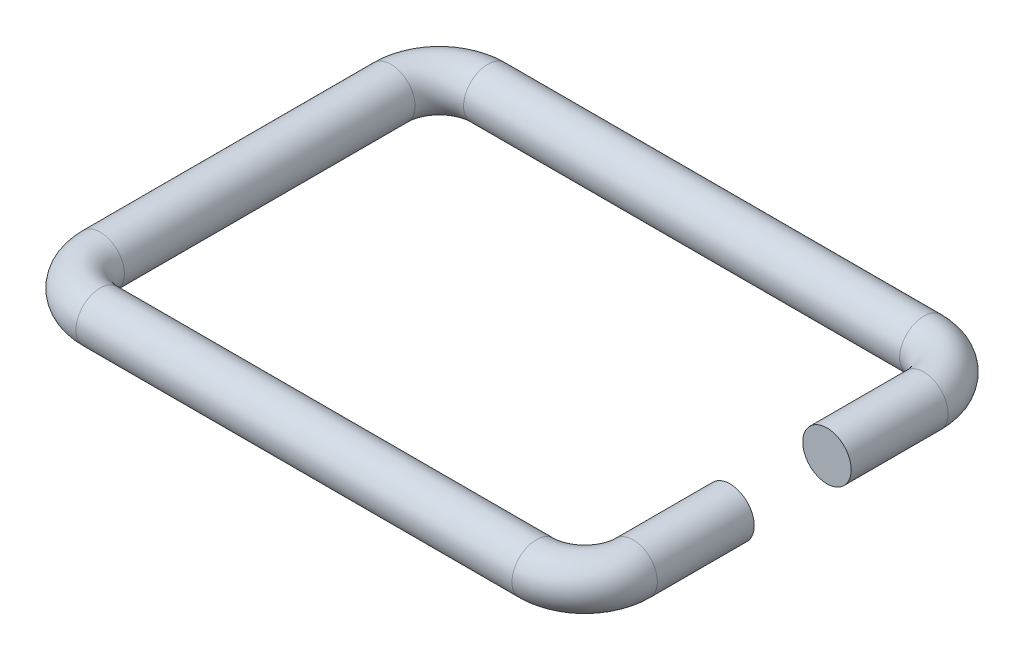
ISO-10303-21;
HEADER;
FILE_DESCRIPTION(('STEP AP214'),'2;1');
FILE_NAME('part.step','',(''),(''),'','','');
FILE_SCHEMA(('AUTOMOTIVE_DESIGN { 1 0 10303 214 1 1 1 1 }'));
ENDSEC;
DATA;
#1=APPLICATION_CONTEXT('core data for automotive mechanical design processes');
#2=APPLICATION_PROTOCOL_DEFINITION('international standard','automotive_design',2000,#1);
#3=PRODUCT_CONTEXT('',#1,'mechanical');
#4=PRODUCT('Part','Part','',(#3));
#5=PRODUCT_RELATED_PRODUCT_CATEGORY('part','',(#4));
#6=PRODUCT_DEFINITION_FORMATION('','',#4);
#7=PRODUCT_DEFINITION_CONTEXT('part definition',#1,'design');
#8=PRODUCT_DEFINITION('design','',#6,#7);
#9=PRODUCT_DEFINITION_SHAPE('','',#8);
#10=(LENGTH_UNIT() NAMED_UNIT(*) SI_UNIT(.MILLI.,.METRE.));
#11=(NAMED_UNIT(*) PLANE_ANGLE_UNIT() SI_UNIT($,.RADIAN.));
#12=(NAMED_UNIT(*) SI_UNIT($,.STERADIAN.) SOLID_ANGLE_UNIT());
#13=UNCERTAINTY_MEASURE_WITH_UNIT(LENGTH_MEASURE(1.E-05),#10,'distance_accuracy_value','');
#14=(GEOMETRIC_REPRESENTATION_CONTEXT(3) GLOBAL_UNCERTAINTY_ASSIGNED_CONTEXT((#13)) GLOBAL_UNIT_ASSIGNED_CONTEXT((#10,
#11,#12)) REPRESENTATION_CONTEXT('',''));
#15=CARTESIAN_POINT('',(0.,0.,0.));
#16=DIRECTION('',(0.,0.,1.));
#17=DIRECTION('',(1.,0.,0.));
#18=AXIS2_PLACEMENT_3D('',#15,#16,#17);
#19=CARTESIAN_POINT('',(0.,0.,9.99999999999998));
#20=DIRECTION('',(0.,0.,-1.));
#21=DIRECTION('',(-1.,0.,0.));
#22=AXIS2_PLACEMENT_3D('',#19,#20,#21);
#23=CYLINDRICAL_SURFACE('',#22,1.25);
#24=CARTESIAN_POINT('',(0.,0.,9.99999999999998));
#25=DIRECTION('',(0.,0.,1.));
#26=DIRECTION('',(1.,0.,0.));
#27=AXIS2_PLACEMENT_3D('',#24,#25,#26);
#28=CIRCLE('',#27,1.25);
#29=CARTESIAN_POINT('',(1.25,0.,9.99999999999997));
#30=VERTEX_POINT('',#29);
#31=EDGE_CURVE('E36',#30,#30,#28,.T.);
#32=ORIENTED_EDGE('',*,*,#31,.F.);
#33=EDGE_LOOP('',(#32));
#34=FACE_BOUND('',#33,.T.);
#35=CARTESIAN_POINT('',(0.,0.,5.));
#36=DIRECTION('',(0.,0.,1.));
#37=DIRECTION('',(1.,0.,0.));
#38=AXIS2_PLACEMENT_3D('',#35,#36,#37);
#39=CIRCLE('',#38,1.25);
#40=CARTESIAN_POINT('',(1.25,0.,4.99999999999993));
#41=VERTEX_POINT('',#40);
#42=EDGE_CURVE('E10',#41,#41,#39,.T.);
#43=ORIENTED_EDGE('',*,*,#42,.T.);
#44=EDGE_LOOP('',(#43));
#45=FACE_BOUND('',#44,.T.);
#46=ADVANCED_FACE('F30',(#34,#45),#23,.T.);
#47=CARTESIAN_POINT('',(-2.5,0.,10.));
#48=DIRECTION('',(0.,1.,0.));
#49=DIRECTION('',(0.,0.,1.));
#50=AXIS2_PLACEMENT_3D('',#47,#48,#49);
#51=TOROIDAL_SURFACE('',#50,2.5,1.25);
#52=CARTESIAN_POINT('',(-2.50000000000002,0.,12.5));
#53=DIRECTION('',(-1.,0.,0.));
#54=DIRECTION('',(0.,0.,1.));
#55=AXIS2_PLACEMENT_3D('',#52,#53,#54);
#56=CIRCLE('',#55,1.25);
#57=CARTESIAN_POINT('',(-2.50000000000002,0.,13.75));
#58=VERTEX_POINT('',#57);
#59=EDGE_CURVE('E40',#58,#58,#56,.T.);
#60=CARTESIAN_POINT('',(-2.5,0.,10.));
#61=DIRECTION('',(0.,1.,0.));
#62=DIRECTION('',(0.,0.,1.));
#63=AXIS2_PLACEMENT_3D('',#60,#61,#62);
#64=CIRCLE('',#63,3.75);
#65=EDGE_CURVE('',#58,#30,#64,.T.);
#66=ORIENTED_EDGE('',*,*,#59,.F.);
#67=ORIENTED_EDGE('',*,*,#31,.T.);
#68=ORIENTED_EDGE('',*,*,#65,.T.);
#69=ORIENTED_EDGE('',*,*,#65,.F.);
#70=EDGE_LOOP('',(#66,#68,#67,#69));
#71=FACE_BOUND('',#70,.T.);
#72=ADVANCED_FACE('F104',(#71),#51,.T.);
#73=CARTESIAN_POINT('',(-25.,0.,12.5));
#74=DIRECTION('',(1.,0.,0.));
#75=DIRECTION('',(0.,0.,-1.));
#76=AXIS2_PLACEMENT_3D('',#73,#74,#75);
#77=CYLINDRICAL_SURFACE('',#76,1.25);
#78=CARTESIAN_POINT('',(-25.,0.,12.5));
#79=DIRECTION('',(-1.,0.,0.));
#80=DIRECTION('',(0.,0.,1.));
#81=AXIS2_PLACEMENT_3D('',#78,#79,#80);
#82=CIRCLE('',#81,1.25);
#83=CARTESIAN_POINT('',(-25.,0.,13.75));
#84=VERTEX_POINT('',#83);
#85=EDGE_CURVE('E44',#84,#84,#82,.T.);
#86=ORIENTED_EDGE('',*,*,#85,.F.);
#87=EDGE_LOOP('',(#86));
#88=FACE_BOUND('',#87,.T.);
#89=ORIENTED_EDGE('',*,*,#59,.T.);
#90=EDGE_LOOP('',(#89));
#91=FACE_BOUND('',#90,.T.);
#92=ADVANCED_FACE('F98',(#88,#91),#77,.T.);
#93=CARTESIAN_POINT('',(-25.,0.,10.));
#94=DIRECTION('',(0.,1.,0.));
#95=DIRECTION('',(0.,0.,1.));
#96=AXIS2_PLACEMENT_3D('',#93,#94,#95);
#97=TOROIDAL_SURFACE('',#96,2.5,1.25);
#98=CARTESIAN_POINT('',(-27.5,0.,9.99999999999998));
#99=DIRECTION('',(0.,0.,-1.));
#100=DIRECTION('',(-1.,0.,0.));
#101=AXIS2_PLACEMENT_3D('',#98,#99,#100);
#102=CIRCLE('',#101,1.25);
#103=CARTESIAN_POINT('',(-28.75,0.,9.99999999999998));
#104=VERTEX_POINT('',#103);
#105=EDGE_CURVE('E49',#104,#104,#102,.T.);
#106=CARTESIAN_POINT('',(-25.,0.,10.));
#107=DIRECTION('',(0.,1.,0.));
#108=DIRECTION('',(0.,0.,1.));
#109=AXIS2_PLACEMENT_3D('',#106,#107,#108);
#110=CIRCLE('',#109,3.75);
#111=EDGE_CURVE('',#104,#84,#110,.T.);
#112=ORIENTED_EDGE('',*,*,#105,.F.);
#113=ORIENTED_EDGE('',*,*,#85,.T.);
#114=ORIENTED_EDGE('',*,*,#111,.T.);
#115=ORIENTED_EDGE('',*,*,#111,.F.);
#116=EDGE_LOOP('',(#112,#114,#113,#115));
#117=FACE_BOUND('',#116,.T.);
#118=ADVANCED_FACE('F92',(#117),#97,.T.);
#119=CARTESIAN_POINT('',(-27.5,0.,-4.99999999999998));
#120=DIRECTION('',(0.,0.,1.));
#121=DIRECTION('',(1.,0.,0.));
#122=AXIS2_PLACEMENT_3D('',#119,#120,#121);
#123=CYLINDRICAL_SURFACE('',#122,1.25);
#124=CARTESIAN_POINT('',(-27.5,0.,-4.99999999999998));
#125=DIRECTION('',(0.,0.,-1.));
#126=DIRECTION('',(-1.,0.,0.));
#127=AXIS2_PLACEMENT_3D('',#124,#125,#126);
#128=CIRCLE('',#127,1.25);
#129=CARTESIAN_POINT('',(-28.75,0.,-4.99999999999997));
#130=VERTEX_POINT('',#129);
#131=EDGE_CURVE('E52',#130,#130,#128,.T.);
#132=ORIENTED_EDGE('',*,*,#131,.F.);
#133=EDGE_LOOP('',(#132));
#134=FACE_BOUND('',#133,.T.);
#135=ORIENTED_EDGE('',*,*,#105,.T.);
#136=EDGE_LOOP('',(#135));
#137=FACE_BOUND('',#136,.T.);
#138=ADVANCED_FACE('F86',(#134,#137),#123,.T.);
#139=CARTESIAN_POINT('',(-25.,0.,-5.));
#140=DIRECTION('',(0.,1.,0.));
#141=DIRECTION('',(0.,0.,1.));
#142=AXIS2_PLACEMENT_3D('',#139,#140,#141);
#143=TOROIDAL_SURFACE('',#142,2.5,1.25);
#144=CARTESIAN_POINT('',(-25.,0.,-7.5));
#145=DIRECTION('',(1.,0.,0.));
#146=DIRECTION('',(0.,0.,-1.));
#147=AXIS2_PLACEMENT_3D('',#144,#145,#146);
#148=CIRCLE('',#147,1.25);
#149=CARTESIAN_POINT('',(-25.,0.,-8.75));
#150=VERTEX_POINT('',#149);
#151=EDGE_CURVE('E55',#150,#150,#148,.T.);
#152=CARTESIAN_POINT('',(-25.,0.,-5.));
#153=DIRECTION('',(0.,1.,0.));
#154=DIRECTION('',(0.,0.,1.));
#155=AXIS2_PLACEMENT_3D('',#152,#153,#154);
#156=CIRCLE('',#155,3.75);
#157=EDGE_CURVE('',#150,#130,#156,.T.);
#158=ORIENTED_EDGE('',*,*,#151,.F.);
#159=ORIENTED_EDGE('',*,*,#131,.T.);
#160=ORIENTED_EDGE('',*,*,#157,.T.);
#161=ORIENTED_EDGE('',*,*,#157,.F.);
#162=EDGE_LOOP('',(#158,#160,#159,#161));
#163=FACE_BOUND('',#162,.T.);
#164=ADVANCED_FACE('F80',(#163),#143,.T.);
#165=CARTESIAN_POINT('',(-2.50000000000002,0.,-7.5));
#166=DIRECTION('',(-1.,0.,0.));
#167=DIRECTION('',(0.,0.,1.));
#168=AXIS2_PLACEMENT_3D('',#165,#166,#167);
#169=CYLINDRICAL_SURFACE('',#168,1.25);
#170=CARTESIAN_POINT('',(-2.50000000000002,0.,-7.5));
#171=DIRECTION('',(1.,0.,0.));
#172=DIRECTION('',(0.,0.,-1.));
#173=AXIS2_PLACEMENT_3D('',#170,#171,#172);
#174=CIRCLE('',#173,1.25);
#175=CARTESIAN_POINT('',(-2.50000000000003,0.,-8.75));
#176=VERTEX_POINT('',#175);
#177=EDGE_CURVE('E58',#176,#176,#174,.T.);
#178=ORIENTED_EDGE('',*,*,#177,.F.);
#179=EDGE_LOOP('',(#178));
#180=FACE_BOUND('',#179,.T.);
#181=ORIENTED_EDGE('',*,*,#151,.T.);
#182=EDGE_LOOP('',(#181));
#183=FACE_BOUND('',#182,.T.);
#184=ADVANCED_FACE('F74',(#180,#183),#169,.T.);
#185=CARTESIAN_POINT('',(-2.5,0.,-5.));
#186=DIRECTION('',(0.,1.,0.));
#187=DIRECTION('',(0.,0.,1.));
#188=AXIS2_PLACEMENT_3D('',#185,#186,#187);
#189=TOROIDAL_SURFACE('',#188,2.5,1.25);
#190=CARTESIAN_POINT('',(0.,0.,-4.99999999999998));
#191=DIRECTION('',(0.,0.,1.));
#192=DIRECTION('',(1.,0.,0.));
#193=AXIS2_PLACEMENT_3D('',#190,#191,#192);
#194=CIRCLE('',#193,1.25);
#195=CARTESIAN_POINT('',(1.25,0.,-4.99999999999997));
#196=VERTEX_POINT('',#195);
#197=EDGE_CURVE('E61',#196,#196,#194,.T.);
#198=CARTESIAN_POINT('',(-2.5,0.,-5.));
#199=DIRECTION('',(0.,1.,0.));
#200=DIRECTION('',(0.,0.,1.));
#201=AXIS2_PLACEMENT_3D('',#198,#199,#200);
#202=CIRCLE('',#201,3.75);
#203=EDGE_CURVE('',#196,#176,#202,.T.);
#204=ORIENTED_EDGE('',*,*,#197,.F.);
#205=ORIENTED_EDGE('',*,*,#177,.T.);
#206=ORIENTED_EDGE('',*,*,#203,.T.);
#207=ORIENTED_EDGE('',*,*,#203,.F.);
#208=EDGE_LOOP('',(#204,#206,#205,#207));
#209=FACE_BOUND('',#208,.T.);
#210=ADVANCED_FACE('F71',(#209),#189,.T.);
#211=CARTESIAN_POINT('',(0.,0.,-4.99999999999998));
#212=DIRECTION('',(0.,0.,1.));
#213=DIRECTION('',(1.,0.,0.));
#214=AXIS2_PLACEMENT_3D('',#211,#212,#213);
#215=CYLINDRICAL_SURFACE('',#214,1.25);
#216=CARTESIAN_POINT('',(0.,0.,0.));
#217=DIRECTION('',(0.,0.,1.));
#218=DIRECTION('',(1.,0.,0.));
#219=AXIS2_PLACEMENT_3D('',#216,#217,#218);
#220=CIRCLE('',#219,1.25);
#221=CARTESIAN_POINT('',(1.25,0.,0.));
#222=VERTEX_POINT('',#221);
#223=EDGE_CURVE('E62',#222,#222,#220,.T.);
#224=CARTESIAN_POINT('',(1.25,0.,-4.99999999999998));
#225=CARTESIAN_POINT('',(1.25,0.,-4.94791666666665));
#226=CARTESIAN_POINT('',(1.25,0.,-4.89583333333332));
#227=CARTESIAN_POINT('',(1.25,0.,-4.79166666666665));
#228=CARTESIAN_POINT('',(1.25,0.,-4.73958333333332));
#229=CARTESIAN_POINT('',(1.25,0.,-4.63541666666665));
#230=CARTESIAN_POINT('',(1.25,0.,-4.58333333333332));
#231=CARTESIAN_POINT('',(1.25,0.,-4.47916666666665));
#232=CARTESIAN_POINT('',(1.25,0.,-4.42708333333332));
#233=CARTESIAN_POINT('',(1.25,0.,-4.32291666666665));
#234=CARTESIAN_POINT('',(1.25,0.,-4.27083333333332));
#235=CARTESIAN_POINT('',(1.25,0.,-4.16666666666665));
#236=CARTESIAN_POINT('',(1.25,0.,-4.11458333333332));
#237=CARTESIAN_POINT('',(1.25,0.,-4.01041666666665));
#238=CARTESIAN_POINT('',(1.25,0.,-3.95833333333332));
#239=CARTESIAN_POINT('',(1.25,0.,-3.85416666666665));
#240=CARTESIAN_POINT('',(1.25,0.,-3.80208333333332));
#241=CARTESIAN_POINT('',(1.25,0.,-3.69791666666665));
#242=CARTESIAN_POINT('',(1.25,0.,-3.64583333333332));
#243=CARTESIAN_POINT('',(1.25,0.,-3.54166666666665));
#244=CARTESIAN_POINT('',(1.25,0.,-3.48958333333332));
#245=CARTESIAN_POINT('',(1.25,0.,-3.38541666666665));
#246=CARTESIAN_POINT('',(1.25,0.,-3.33333333333332));
#247=CARTESIAN_POINT('',(1.25,0.,-3.22916666666665));
#248=CARTESIAN_POINT('',(1.25,0.,-3.17708333333332));
#249=CARTESIAN_POINT('',(1.25,0.,-3.07291666666666));
#250=CARTESIAN_POINT('',(1.25,0.,-3.02083333333332));
#251=CARTESIAN_POINT('',(1.25,0.,-2.91666666666666));
#252=CARTESIAN_POINT('',(1.25,0.,-2.86458333333332));
#253=CARTESIAN_POINT('',(1.25,0.,-2.76041666666666));
#254=CARTESIAN_POINT('',(1.25,0.,-2.70833333333332));
#255=CARTESIAN_POINT('',(1.25,0.,-2.60416666666666));
#256=CARTESIAN_POINT('',(1.25,0.,-2.55208333333332));
#257=CARTESIAN_POINT('',(1.25,0.,-2.44791666666666));
#258=CARTESIAN_POINT('',(1.25,0.,-2.39583333333333));
#259=CARTESIAN_POINT('',(1.25,0.,-2.29166666666666));
#260=CARTESIAN_POINT('',(1.25,0.,-2.23958333333333));
#261=CARTESIAN_POINT('',(1.25,0.,-2.13541666666666));
#262=CARTESIAN_POINT('',(1.25,0.,-2.08333333333333));
#263=CARTESIAN_POINT('',(1.25,0.,-1.97916666666666));
#264=CARTESIAN_POINT('',(1.25,0.,-1.92708333333333));
#265=CARTESIAN_POINT('',(1.25,0.,-1.82291666666666));
#266=CARTESIAN_POINT('',(1.25,0.,-1.77083333333333));
#267=CARTESIAN_POINT('',(1.25,0.,-1.66666666666666));
#268=CARTESIAN_POINT('',(1.25,0.,-1.61458333333333));
#269=CARTESIAN_POINT('',(1.25,0.,-1.51041666666666));
#270=CARTESIAN_POINT('',(1.25,0.,-1.45833333333333));
#271=CARTESIAN_POINT('',(1.25,0.,-1.35416666666666));
#272=CARTESIAN_POINT('',(1.25,0.,-1.30208333333333));
#273=CARTESIAN_POINT('',(1.25,0.,-1.19791666666666));
#274=CARTESIAN_POINT('',(1.25,0.,-1.14583333333333));
#275=CARTESIAN_POINT('',(1.25,0.,-1.04166666666666));
#276=CARTESIAN_POINT('',(1.25,0.,-0.98958333333333));
#277=CARTESIAN_POINT('',(1.25,0.,-0.885416666666664));
#278=CARTESIAN_POINT('',(1.25,0.,-0.833333333333331));
#279=CARTESIAN_POINT('',(1.25,0.,-0.729166666666665));
#280=CARTESIAN_POINT('',(1.25,0.,-0.677083333333332));
#281=CARTESIAN_POINT('',(1.25,0.,-0.572916666666666));
#282=CARTESIAN_POINT('',(1.25,0.,-0.520833333333333));
#283=CARTESIAN_POINT('',(1.25,0.,-0.416666666666666));
#284=CARTESIAN_POINT('',(1.25,0.,-0.364583333333333));
#285=CARTESIAN_POINT('',(1.25,0.,-0.260416666666666));
#286=CARTESIAN_POINT('',(1.25,0.,-0.208333333333333));
#287=CARTESIAN_POINT('',(1.25,0.,-0.104166666666667));
#288=CARTESIAN_POINT('',(1.25,0.,-0.0520833333333339));
#289=CARTESIAN_POINT('',(1.25,0.,0.));
#290=B_SPLINE_CURVE_WITH_KNOTS('',3,(#224,#225,#226,#227,#228,#229,#230,#231,#232,#233,#234,
#235,#236,#237,#238,#239,#240,#241,#242,#243,#244,#245,#246,#247,#248,#249,#250,#251,#252,#253,
#254,#255,#256,#257,#258,#259,#260,#261,#262,#263,#264,#265,#266,#267,#268,#269,#270,#271,#272,
#273,#274,#275,#276,#277,#278,#279,#280,#281,#282,#283,#284,#285,#286,#287,#288,#289),
.UNSPECIFIED.,.F.,.F.,(4,2,2,2,2,2,2,2,2,2,2,2,2,2,2,2,2,2,2,2,2,2,2,2,2,2,2,2,2,2,2,2,4),(0.,
0.15625,0.312499999999999,0.468749999999999,0.624999999999998,0.781249999999998,
0.937499999999997,1.09375,1.25,1.40625,1.56249999999999,1.71874999999999,1.87499999999999,
2.03124999999999,2.18749999999999,2.34374999999999,2.49999999999999,2.65624999999999,
2.81249999999999,2.96874999999999,3.12499999999999,3.28124999999999,3.43749999999999,
3.59374999999999,3.74999999999999,3.90624999999999,4.06249999999999,4.21874999999998,
4.37499999999998,4.53124999999998,4.68749999999998,4.84374999999998,4.99999999999998),.UNSPECIFIED.);
#291=EDGE_CURVE('BSEAM68',#196,#222,#290,.T.);
#292=ORIENTED_EDGE('',*,*,#197,.T.);
#293=ORIENTED_EDGE('',*,*,#223,.F.);
#294=ORIENTED_EDGE('',*,*,#291,.T.);
#295=ORIENTED_EDGE('',*,*,#291,.F.);
#296=EDGE_LOOP('',(#292,#294,#293,#295));
#297=FACE_BOUND('',#296,.T.);
#298=ADVANCED_FACE('F68',(#297),#215,.T.);
#299=CARTESIAN_POINT('',(0.,0.,5.));
#300=DIRECTION('',(0.,0.,1.));
#301=DIRECTION('',(1.,0.,0.));
#302=AXIS2_PLACEMENT_3D('',#299,#300,#301);
#303=PLANE('',#302);
#304=ORIENTED_EDGE('',*,*,#42,.F.);
#305=EDGE_LOOP('',(#304));
#306=FACE_BOUND('',#305,.T.);
#307=ADVANCED_FACE('F116',(#306),#303,.F.);
#308=CARTESIAN_POINT('',(0.,0.,0.));
#309=DIRECTION('',(0.,0.,1.));
#310=DIRECTION('',(1.,0.,0.));
#311=AXIS2_PLACEMENT_3D('',#308,#309,#310);
#312=PLANE('',#311);
#313=ORIENTED_EDGE('',*,*,#223,.T.);
#314=EDGE_LOOP('',(#313));
#315=FACE_BOUND('',#314,.T.);
#316=ADVANCED_FACE('F117',(#315),#312,.T.);
#317=CLOSED_SHELL('',(#46,#72,#92,#118,#138,#164,#184,#210,#298,#307,#316));
#318=MANIFOLD_SOLID_BREP('B2',#317);
#319=ADVANCED_BREP_SHAPE_REPRESENTATION('',(#18,#318),#14);
#320=SHAPE_DEFINITION_REPRESENTATION(#9,#319);
ENDSEC;
END-ISO-10303-21;
